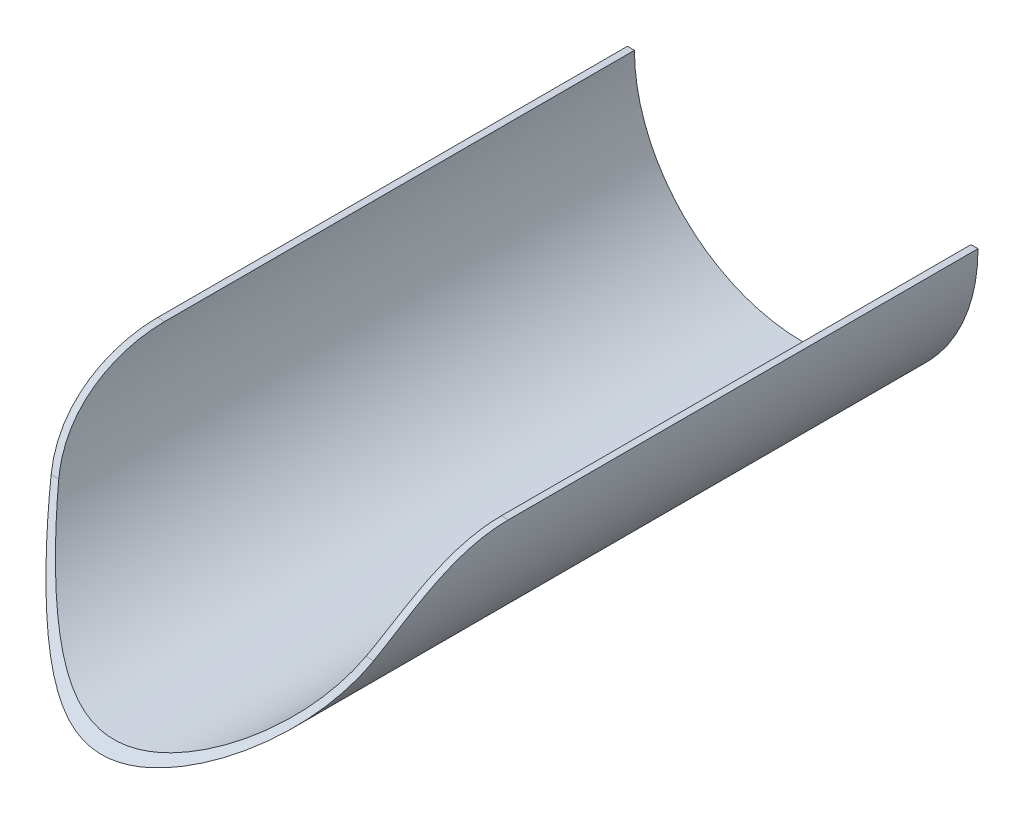
ISO-10303-21;
HEADER;
FILE_DESCRIPTION(('STEP AP214'),'2;1');
FILE_NAME('part.step','',(''),(''),'','','');
FILE_SCHEMA(('AUTOMOTIVE_DESIGN { 1 0 10303 214 1 1 1 1 }'));
ENDSEC;
DATA;
#1=APPLICATION_CONTEXT('core data for automotive mechanical design processes');
#2=APPLICATION_PROTOCOL_DEFINITION('international standard','automotive_design',2000,#1);
#3=PRODUCT_CONTEXT('',#1,'mechanical');
#4=PRODUCT('Part','Part','',(#3));
#5=PRODUCT_RELATED_PRODUCT_CATEGORY('part','',(#4));
#6=PRODUCT_DEFINITION_FORMATION('','',#4);
#7=PRODUCT_DEFINITION_CONTEXT('part definition',#1,'design');
#8=PRODUCT_DEFINITION('design','',#6,#7);
#9=PRODUCT_DEFINITION_SHAPE('','',#8);
#10=(LENGTH_UNIT() NAMED_UNIT(*) SI_UNIT(.MILLI.,.METRE.));
#11=(NAMED_UNIT(*) PLANE_ANGLE_UNIT() SI_UNIT($,.RADIAN.));
#12=(NAMED_UNIT(*) SI_UNIT($,.STERADIAN.) SOLID_ANGLE_UNIT());
#13=UNCERTAINTY_MEASURE_WITH_UNIT(LENGTH_MEASURE(1.E-05),#10,'distance_accuracy_value','');
#14=(GEOMETRIC_REPRESENTATION_CONTEXT(3) GLOBAL_UNCERTAINTY_ASSIGNED_CONTEXT((#13)) GLOBAL_UNIT_ASSIGNED_CONTEXT((#10,
#11,#12)) REPRESENTATION_CONTEXT('',''));
#15=CARTESIAN_POINT('',(0.,0.,0.));
#16=DIRECTION('',(0.,0.,1.));
#17=DIRECTION('',(1.,0.,0.));
#18=AXIS2_PLACEMENT_3D('',#15,#16,#17);
#19=CARTESIAN_POINT('',(0.,0.,-200.));
#20=DIRECTION('',(0.,0.,1.));
#21=DIRECTION('',(1.,0.,0.));
#22=AXIS2_PLACEMENT_3D('',#19,#20,#21);
#23=CYLINDRICAL_SURFACE('',#22,50.);
#24=DIRECTION('',(0.,0.,1.));
#25=VECTOR('',#24,1.);
#26=CARTESIAN_POINT('',(50.,0.,-200.));
#27=LINE('',#26,#25);
#28=CARTESIAN_POINT('',(50.,0.,-200.));
#29=VERTEX_POINT('',#28);
#30=CARTESIAN_POINT('',(50.,0.,-66.028109136122));
#31=VERTEX_POINT('',#30);
#32=EDGE_CURVE('E105',#29,#31,#27,.T.);
#33=ORIENTED_EDGE('',*,*,#32,.T.);
#34=CARTESIAN_POINT('',(50.,0.,-66.0281091361219));
#35=CARTESIAN_POINT('',(49.9999823365461,7.37992042129467E-06,-65.4691817525423));
#36=CARTESIAN_POINT('',(49.9999993858969,-0.0117147199404949,-64.9102549220402));
#37=CARTESIAN_POINT('',(49.999975918324,-0.058564281366747,-63.7933970079425));
#38=CARTESIAN_POINT('',(49.9999354028434,-0.0936911561537507,-63.2354658997347));
#39=CARTESIAN_POINT('',(49.9996698278945,-0.187295856108741,-62.1215756873062));
#40=CARTESIAN_POINT('',(49.9994447716533,-0.245773272935,-61.5656165487723));
#41=CARTESIAN_POINT('',(49.9985596761442,-0.385975458941323,-60.4566249126709));
#42=CARTESIAN_POINT('',(49.9978996269442,-0.467700758916742,-59.9035924822198));
#43=CARTESIAN_POINT('',(49.9958057025399,-0.654303908152532,-58.8011520009052));
#44=CARTESIAN_POINT('',(49.9943714247691,-0.759193785243319,-58.2517459861894));
#45=CARTESIAN_POINT('',(49.9902956401348,-0.991906418387271,-57.1578605990558));
#46=CARTESIAN_POINT('',(49.9876542201822,-1.11972752305347,-56.6133808748363));
#47=CARTESIAN_POINT('',(49.9806442436695,-1.39806964983598,-55.5303226121921));
#48=CARTESIAN_POINT('',(49.9762758862357,-1.54858805358068,-54.9917434007585));
#49=CARTESIAN_POINT('',(49.9652017434662,-1.87209157998755,-53.9212751727426));
#50=CARTESIAN_POINT('',(49.9584953191497,-2.0450828362406,-53.3893880262787));
#51=CARTESIAN_POINT('',(49.9338520839336,-2.59750480108549,-51.8047162148706));
#52=CARTESIAN_POINT('',(49.911393259374,-3.01025931786121,-50.7634049833434));
#53=CARTESIAN_POINT('',(49.8480772858908,-3.92140980930672,-48.7195263274592));
#54=CARTESIAN_POINT('',(49.8072208717237,-4.41980236330324,-47.7169573575635));
#55=CARTESIAN_POINT('',(49.7266148423895,-5.22847732353928,-46.247964089247));
#56=CARTESIAN_POINT('',(49.6965174889052,-5.50828255745755,-45.7640106580392));
#57=CARTESIAN_POINT('',(49.6288817516146,-6.08762472485334,-44.8087157222229));
#58=CARTESIAN_POINT('',(49.5913452424956,-6.38715667447343,-44.3373710740625));
#59=CARTESIAN_POINT('',(49.507804225239,-7.00532535392411,-43.4081425133676));
#60=CARTESIAN_POINT('',(49.4617995133157,-7.32396254339406,-42.9502589250783));
#61=CARTESIAN_POINT('',(49.360268664288,-7.97959394205546,-42.0488642756767));
#62=CARTESIAN_POINT('',(49.3047419652668,-8.31658923380448,-41.6053540646119));
#63=CARTESIAN_POINT('',(49.1846308744111,-8.99940092558499,-40.7445758347298));
#64=CARTESIAN_POINT('',(49.120307912005,-9.34478556200402,-40.3269288580288));
#65=CARTESIAN_POINT('',(48.9806181850818,-10.0513042216273,-39.5070138367654));
#66=CARTESIAN_POINT('',(48.9052504313112,-10.4124396535527,-39.104747173852));
#67=CARTESIAN_POINT('',(48.742500749077,-11.1494871951787,-38.3163943951228));
#68=CARTESIAN_POINT('',(48.6551171104435,-11.5254014028317,-37.9303105927692));
#69=CARTESIAN_POINT('',(48.4674140506273,-12.2908523090685,-37.1751688516538));
#70=CARTESIAN_POINT('',(48.3670947982314,-12.680388829857,-36.8061106908226));
#71=CARTESIAN_POINT('',(48.1529206285036,-13.470837206988,-36.0866936784044));
#72=CARTESIAN_POINT('',(48.0391020541867,-13.8717164037775,-35.7362881404191));
#73=CARTESIAN_POINT('',(47.7969239637269,-14.6844758686762,-35.0538330919658));
#74=CARTESIAN_POINT('',(47.668566195232,-15.0963548100491,-34.7217813824456));
#75=CARTESIAN_POINT('',(47.3966635562282,-15.9294746354722,-34.0767842409296));
#76=CARTESIAN_POINT('',(47.2531288228928,-16.3507091239547,-33.7638262732077));
#77=CARTESIAN_POINT('',(46.9501898997603,-17.2012616327289,-33.1572971619909));
#78=CARTESIAN_POINT('',(46.7907883912024,-17.6305782773525,-32.8637227568732));
#79=CARTESIAN_POINT('',(46.5234427521607,-18.3206316464158,-32.411151615802));
#80=CARTESIAN_POINT('',(46.4207866612099,-18.5792650738851,-32.2457811371683));
#81=CARTESIAN_POINT('',(46.2096718814042,-19.0982899235291,-31.9222154091747));
#82=CARTESIAN_POINT('',(46.1012183739589,-19.3586796000005,-31.7640139787083));
#83=CARTESIAN_POINT('',(45.989776227236,-19.6199001671454,-31.6093420053416));
#84=B_SPLINE_CURVE_WITH_KNOTS('',3,(#34,#35,#36,#37,#38,#39,#40,#41,#42,#43,#44,#45,#46,#47,#48,
#49,#50,#51,#52,#53,#54,#55,#56,#57,#58,#59,#60,#61,#62,#63,#64,#65,#66,#67,#68,#69,#70,#71,#72,
#73,#74,#75,#76,#77,#78,#79,#80,#81,#82,#83),.UNSPECIFIED.,.F.,.F.,(4,2,2,2,2,2,2,2,2,2,2,2,2,2,
2,2,2,2,2,2,2,2,2,2,4),(0.,1.67665844555418,3.35327485738521,5.02986195073361,6.70648732696882,
8.38398531908419,10.0613625550334,11.7385464357422,13.4161890414057,16.7729680450403,
20.1296129987069,21.8086485438499,23.4872615042891,25.1659148655001,26.8446673224768,
28.4814108378919,30.1183010419149,31.7554244591673,33.3925265170113,35.0253171391137,
36.6579117034918,38.2894226135922,39.9206582901536,40.8916124346742,41.8617128492752),.UNSPECIFIED.);
#85=CARTESIAN_POINT('',(45.9897762272361,-19.6199001671454,-31.6093420053416));
#86=VERTEX_POINT('',#85);
#87=EDGE_CURVE('E142',#31,#86,#84,.T.);
#88=ORIENTED_EDGE('',*,*,#87,.T.);
#89=CARTESIAN_POINT('',(-50.,0.,-40.));
#90=CARTESIAN_POINT('',(-50.0000166515254,-0.70213859406181,-39.8029483411825));
#91=CARTESIAN_POINT('',(-49.9852107268647,-1.40159674025909,-39.5964983749295));
#92=CARTESIAN_POINT('',(-49.926753027816,-2.79357891929848,-39.1654226417842));
#93=CARTESIAN_POINT('',(-49.8831050128129,-3.48610384390162,-38.9407992470322));
#94=CARTESIAN_POINT('',(-49.7678274407851,-4.86204933818628,-38.474210575254));
#95=CARTESIAN_POINT('',(-49.6962296789266,-5.54547934378737,-38.2322652578437));
#96=CARTESIAN_POINT('',(-49.5259609542399,-6.90268863252776,-37.7315319779802));
#97=CARTESIAN_POINT('',(-49.4272891944134,-7.57646763094839,-37.4727435198735));
#98=CARTESIAN_POINT('',(-49.0938657517247,-9.57069769569858,-36.6765460334972));
#99=CARTESIAN_POINT('',(-48.820713358768,-10.8755231810728,-36.1153985601156));
#100=CARTESIAN_POINT('',(-48.179265895774,-13.4350511781154,-34.9361142832164));
#101=CARTESIAN_POINT('',(-47.8109449507695,-14.6897399510399,-34.3179620103501));
#102=CARTESIAN_POINT('',(-46.9889554966474,-17.13758971285,-33.034580796262));
#103=CARTESIAN_POINT('',(-46.5356985242181,-18.3310134347792,-32.3695881206077));
#104=CARTESIAN_POINT('',(-45.5500974547824,-20.6588080431705,-30.9968150768149));
#105=CARTESIAN_POINT('',(-45.0177587145596,-21.7931829224178,-30.289037608726));
#106=CARTESIAN_POINT('',(-43.8793966944171,-24.0030589302271,-28.8357418110219));
#107=CARTESIAN_POINT('',(-43.2732163287611,-25.0784272318827,-28.0901450637696));
#108=CARTESIAN_POINT('',(-41.9939045362479,-27.1663629335177,-26.5691659027884));
#109=CARTESIAN_POINT('',(-41.3207686860257,-28.1789261771429,-25.7937815232413));
#110=CARTESIAN_POINT('',(-39.7858502447651,-30.316915620651,-24.0782181759963));
#111=CARTESIAN_POINT('',(-38.9119008960172,-31.4299439078302,-23.1334560595002));
#112=CARTESIAN_POINT('',(-37.0835752987146,-33.5676529565,-21.2219826179272));
#113=CARTESIAN_POINT('',(-36.1291862950728,-34.5923196544326,-20.2552678296996));
#114=CARTESIAN_POINT('',(-34.1431264627222,-36.5540229133261,-18.3103922395883));
#115=CARTESIAN_POINT('',(-33.1114092489635,-37.4910061076603,-17.3322248695596));
#116=CARTESIAN_POINT('',(-31.507514772844,-38.829899170851,-15.866518752148));
#117=CARTESIAN_POINT('',(-30.9635005028348,-39.265097329751,-15.3782106584818));
#118=CARTESIAN_POINT('',(-29.8564962599313,-40.1132875982573,-14.4038591798532));
#119=CARTESIAN_POINT('',(-29.2935067158244,-40.5262802090995,-13.917815743998));
#120=CARTESIAN_POINT('',(-27.7629814618052,-41.6003250927633,-12.6242685254055));
#121=CARTESIAN_POINT('',(-26.7780621925471,-42.2413682723158,-11.8204536695296));
#122=CARTESIAN_POINT('',(-25.2584885750861,-43.1550439664906,-10.63197777045));
#123=CARTESIAN_POINT('',(-24.7448412861316,-43.4516670595139,-10.2386285723616));
#124=CARTESIAN_POINT('',(-23.7029744536882,-44.0286687310526,-9.45941216737689));
#125=CARTESIAN_POINT('',(-23.174756070672,-44.3090485977307,-9.07354436879036));
#126=CARTESIAN_POINT('',(-22.1039284002549,-44.8528307752042,-8.31176712045077));
#127=CARTESIAN_POINT('',(-21.561340355166,-45.1162563659735,-7.93584445190159));
#128=CARTESIAN_POINT('',(-20.4604584175561,-45.6260624709951,-7.19570555061834));
#129=CARTESIAN_POINT('',(-19.9021660530581,-45.8724446355504,-6.83148818630142));
#130=CARTESIAN_POINT('',(-18.7694308618506,-46.3474425481284,-6.11758992915975));
#131=CARTESIAN_POINT('',(-18.1949973401925,-46.5760682574212,-5.76790093796448));
#132=CARTESIAN_POINT('',(-17.0288636918486,-47.0149548912113,-5.08592719815953));
#133=CARTESIAN_POINT('',(-16.4371607211525,-47.2252127677841,-4.75364534170626));
#134=CARTESIAN_POINT('',(-15.1310165015744,-47.6613638234835,-4.05403697486714));
#135=CARTESIAN_POINT('',(-14.4131781367523,-47.8835807453031,-3.69071633883252));
#136=CARTESIAN_POINT('',(-12.9523233735428,-48.2992104765723,-3.00036302412713));
#137=CARTESIAN_POINT('',(-12.2093154193711,-48.4926328311795,-2.67331832949106));
#138=CARTESIAN_POINT('',(-10.6990268608898,-48.848046515203,-2.0640424903433));
#139=CARTESIAN_POINT('',(-9.93178463211347,-49.0100848989931,-1.78174437398136));
#140=CARTESIAN_POINT('',(-8.37337948270041,-49.3002450106318,-1.27050885851047));
#141=CARTESIAN_POINT('',(-7.58222162063993,-49.4283738557807,-1.0415602630353));
#142=CARTESIAN_POINT('',(-6.1128333896404,-49.6295061147206,-0.679170062350853));
#143=CARTESIAN_POINT('',(-5.43773534799316,-49.7081360649757,-0.536173247439457));
#144=CARTESIAN_POINT('',(-4.07647089353453,-49.8382344346665,-0.298453695164832));
#145=CARTESIAN_POINT('',(-3.39030576600388,-49.8897059850781,-0.203725393173996));
#146=CARTESIAN_POINT('',(-2.01182456477616,-49.9642723452382,-0.0661978810917193));
#147=CARTESIAN_POINT('',(-1.31951453914498,-49.987392485385,-0.0233523171064028));
#148=CARTESIAN_POINT('',(0.0667362609040078,-50.004759939618,0.00881521573370331));
#149=CARTESIAN_POINT('',(0.760677056252655,-49.9990068810726,-0.00186350618499218));
#150=CARTESIAN_POINT('',(2.14420646646611,-49.9587924744942,-0.0762691177622148));
#151=CARTESIAN_POINT('',(2.83379844499473,-49.9243570500153,-0.139948104943799));
#152=CARTESIAN_POINT('',(4.20439825581935,-49.8276543944025,-0.317749796118042));
#153=CARTESIAN_POINT('',(4.88540599208157,-49.7653868521883,-0.431873063927503));
#154=CARTESIAN_POINT('',(6.23580346116689,-49.6142826043149,-0.706596247533746));
#155=CARTESIAN_POINT('',(6.90517729514924,-49.5254121660796,-0.867255162290565));
#156=CARTESIAN_POINT('',(8.22872588592447,-49.322779393387,-1.2299036260258));
#157=CARTESIAN_POINT('',(8.88289857995888,-49.2090137022718,-1.43189874817816));
#158=CARTESIAN_POINT('',(10.5432511987192,-48.88668267134,-1.9974874516959));
#159=CARTESIAN_POINT('',(11.5371709600772,-48.6610762715996,-2.3875004515786));
#160=CARTESIAN_POINT('',(13.4816436443705,-48.1586475326466,-3.2365169000886));
#161=CARTESIAN_POINT('',(14.4321695004924,-47.881793757791,-3.69556266149235));
#162=CARTESIAN_POINT('',(16.2934773649924,-47.2808808174802,-4.6672423060366));
#163=CARTESIAN_POINT('',(17.2041332919659,-46.9566842377902,-5.18003091303463));
#164=CARTESIAN_POINT('',(18.9850792127829,-46.2653136934132,-6.24461338090646));
#165=CARTESIAN_POINT('',(19.8553723402157,-45.8981430728655,-6.7964042053972));
#166=CARTESIAN_POINT('',(21.4484778382986,-45.1732936586556,-7.85555468874235));
#167=CARTESIAN_POINT('',(22.1758339881033,-44.82049905692,-8.35946528124142));
#168=CARTESIAN_POINT('',(23.6036992346997,-44.0852619372163,-9.38362043560669));
#169=CARTESIAN_POINT('',(24.3042044892813,-43.7028151996889,-9.90386731586949));
#170=CARTESIAN_POINT('',(25.6799216337246,-42.9088880272792,-10.9564323306735));
#171=CARTESIAN_POINT('',(26.3551189215496,-42.4973912143327,-11.4887571579819));
#172=CARTESIAN_POINT('',(27.680739515376,-41.646093399702,-12.5614514889695));
#173=CARTESIAN_POINT('',(28.3311638970414,-41.2062936291956,-13.1018206419359));
#174=CARTESIAN_POINT('',(29.6089847906771,-40.2979343082763,-14.1883857109376));
#175=CARTESIAN_POINT('',(30.2363408109814,-39.829327716175,-14.7345898858781));
#176=CARTESIAN_POINT('',(31.4672166557683,-38.8641980400764,-15.8291915926487));
#177=CARTESIAN_POINT('',(32.0707362987125,-38.3676747435347,-16.3775891411485));
#178=CARTESIAN_POINT('',(33.2538484185562,-37.3469119065694,-17.4740129308747));
#179=CARTESIAN_POINT('',(33.833446458309,-36.822678875321,-18.022039228944));
#180=CARTESIAN_POINT('',(34.9686484774629,-35.7464036078525,-19.1156399481603));
#181=CARTESIAN_POINT('',(35.524252370468,-35.1943612715147,-19.6612143604724));
#182=CARTESIAN_POINT('',(36.6343303471235,-34.038146080434,-20.7711844883897));
#183=CARTESIAN_POINT('',(37.1877319805618,-33.4327526703666,-21.3353827298163));
#184=CARTESIAN_POINT('',(38.2671266022374,-32.1916659270584,-22.4566625075091));
#185=CARTESIAN_POINT('',(38.7931193495359,-31.5559723275568,-23.0137439811827));
#186=CARTESIAN_POINT('',(39.8166659769652,-30.2542343624833,-24.1186889631493));
#187=CARTESIAN_POINT('',(40.3142172910322,-29.5881872680489,-24.6665516365603));
#188=CARTESIAN_POINT('',(41.2795609625968,-28.225784661786,-25.750953576122));
#189=CARTESIAN_POINT('',(41.7473496757245,-27.5294254558158,-26.2874914502196));
#190=CARTESIAN_POINT('',(42.6492021146598,-26.1103178778143,-27.3443246177579));
#191=CARTESIAN_POINT('',(43.0834270397772,-25.3877237892635,-27.864689301449));
#192=CARTESIAN_POINT('',(43.9190165296726,-23.9131363751196,-28.8899179796105));
#193=CARTESIAN_POINT('',(44.3203820416326,-23.1611438978673,-29.3947824206174));
#194=CARTESIAN_POINT('',(45.0882246809871,-21.6283754558449,-30.386807693329));
#195=CARTESIAN_POINT('',(45.454706827679,-20.8476036545701,-30.8739710657491));
#196=CARTESIAN_POINT('',(46.1506616568155,-19.2579628522521,-31.8284739420908));
#197=CARTESIAN_POINT('',(46.4801366945637,-18.4490956436256,-32.2958147064354));
#198=CARTESIAN_POINT('',(47.0420302420258,-16.957557412838,-33.1234500131079));
#199=CARTESIAN_POINT('',(47.2810954303527,-16.2794474662633,-33.4874679006216));
#200=CARTESIAN_POINT('',(47.7318651087405,-14.9060833068806,-34.1997264663915));
#201=CARTESIAN_POINT('',(47.9435711224232,-14.2108300513468,-34.5479680225233));
#202=CARTESIAN_POINT('',(48.3382035610545,-12.8043483469487,-35.2273661517905));
#203=CARTESIAN_POINT('',(48.5211414724719,-12.0931264043175,-35.5585295081971));
#204=CARTESIAN_POINT('',(48.8569543666851,-10.6556417108114,-36.2027125714298));
#205=CARTESIAN_POINT('',(49.0098337741674,-9.92938119107562,-36.5157349438625));
#206=CARTESIAN_POINT('',(49.2858304149301,-8.45437462698053,-37.1261421921178));
#207=CARTESIAN_POINT('',(49.408575719533,-7.70546446656435,-37.4232993409947));
#208=CARTESIAN_POINT('',(49.6205864577039,-6.19507647526631,-37.9968355323394));
#209=CARTESIAN_POINT('',(49.7098533823524,-5.43359920568343,-38.2732154997553));
#210=CARTESIAN_POINT('',(49.8537555202546,-3.89848433794986,-38.8046607671039));
#211=CARTESIAN_POINT('',(49.9083300770188,-3.12482785170756,-39.0596880617491));
#212=CARTESIAN_POINT('',(49.9814692343807,-1.56857111378079,-39.547076439521));
#213=CARTESIAN_POINT('',(50.0000270252091,-0.785969198895061,-39.7794332283995));
#214=CARTESIAN_POINT('',(50.,0.,-40.));
#215=B_SPLINE_CURVE_WITH_KNOTS('',3,(#89,#90,#91,#92,#93,#94,#95,#96,#97,#98,#99,#100,#101,#102,
#103,#104,#105,#106,#107,#108,#109,#110,#111,#112,#113,#114,#115,#116,#117,#118,#119,#120,#121,
#122,#123,#124,#125,#126,#127,#128,#129,#130,#131,#132,#133,#134,#135,#136,#137,#138,#139,#140,
#141,#142,#143,#144,#145,#146,#147,#148,#149,#150,#151,#152,#153,#154,#155,#156,#157,#158,#159,
#160,#161,#162,#163,#164,#165,#166,#167,#168,#169,#170,#171,#172,#173,#174,#175,#176,#177,#178,
#179,#180,#181,#182,#183,#184,#185,#186,#187,#188,#189,#190,#191,#192,#193,#194,#195,#196,#197,
#198,#199,#200,#201,#202,#203,#204,#205,#206,#207,#208,#209,#210,#211,#212,#213,#214),
.UNSPECIFIED.,.F.,.F.,(4,2,2,2,2,2,2,2,2,2,2,2,2,2,2,2,2,2,2,2,2,2,2,2,2,2,2,2,2,2,2,2,2,2,2,2,
2,2,2,2,2,2,2,2,2,2,2,2,2,2,2,2,2,2,2,2,2,2,2,2,2,2,4),(0.,2.1875168602486,4.37474864767646,
6.55949949362215,8.74431466067948,13.0775730213155,17.4120107748684,21.7259660433559,
26.0396292293895,30.3626347535307,34.6859260637913,39.7857959121698,44.8864759592927,
49.990240502492,52.5420900865031,55.0938820445596,59.3621750712863,61.4970426792057,
63.6317407498731,65.7634422088098,67.8949369668008,70.0252271991579,72.1558702591548,
74.6583921650178,77.1600826497386,79.6579927799569,82.1553782052529,84.2369144698139,
86.3182107104837,88.397646071422,90.4771082691967,92.5546930545396,94.6323010616792,
96.7125547242202,98.7930890429624,102.061446088057,105.3318146594,108.611871557416,
111.891673378579,114.748436512153,117.605606917713,120.464401226142,123.323071261065,
126.186540356646,129.050031256258,131.912852469234,134.775683989535,137.761415572073,
140.747173396359,143.733200180076,146.719591895805,149.690611695186,152.661545823897,
155.632051822586,158.602368657274,161.01935763908,163.436211961656,165.852098823932,
168.267629794963,170.711624078081,173.155509496169,175.603656160536,178.052265656315),.UNSPECIFIED.);
#216=CARTESIAN_POINT('',(-45.989776227236,-19.6199001671455,-31.6093420053416));
#217=VERTEX_POINT('',#216);
#218=EDGE_CURVE('E116',#217,#86,#215,.T.);
#219=ORIENTED_EDGE('',*,*,#218,.F.);
#220=CARTESIAN_POINT('',(-45.989776227236,-19.6199001671454,-31.6093420053416));
#221=CARTESIAN_POINT('',(-46.1638864939545,-19.2118105365517,-31.8509595585323));
#222=CARTESIAN_POINT('',(-46.3306911932307,-18.8057340855283,-32.1012288183695));
#223=CARTESIAN_POINT('',(-46.6500527366944,-17.9989022839164,-32.6188137318974));
#224=CARTESIAN_POINT('',(-46.8026101775529,-17.5981467110947,-32.8861286709304));
#225=CARTESIAN_POINT('',(-47.0937744661689,-16.8034368394577,-33.4374157072449));
#226=CARTESIAN_POINT('',(-47.2323889835127,-16.4094789013722,-33.7213785094496));
#227=CARTESIAN_POINT('',(-47.4962414124045,-15.6293504049217,-34.3057361794275));
#228=CARTESIAN_POINT('',(-47.6214792587271,-15.243179884536,-34.6061311273136));
#229=CARTESIAN_POINT('',(-47.8584885484955,-14.4818222546159,-35.22127872464));
#230=CARTESIAN_POINT('',(-47.9703286086906,-14.106587348847,-35.5359457360223));
#231=CARTESIAN_POINT('',(-48.1819274488224,-13.3660109095061,-36.1806332739209));
#232=CARTESIAN_POINT('',(-48.2816849755276,-13.000670405253,-36.5106553882026));
#233=CARTESIAN_POINT('',(-48.5637933940873,-11.9210333186082,-37.5229496227836));
#234=CARTESIAN_POINT('',(-48.7290277261384,-11.2229657591137,-38.2275749343864));
#235=CARTESIAN_POINT('',(-49.0192290843347,-9.87865243067505,-39.6901115836841));
#236=CARTESIAN_POINT('',(-49.1442555150282,-9.23233128081551,-40.4479422767863));
#237=CARTESIAN_POINT('',(-49.3604897155151,-7.99599327707887,-42.0127443198062));
#238=CARTESIAN_POINT('',(-49.4516972956026,-7.40597673905476,-42.8197159453492));
#239=CARTESIAN_POINT('',(-49.6064798277029,-6.28626726804493,-44.4784695592511));
#240=CARTESIAN_POINT('',(-49.6700187056573,-5.75665374732744,-45.3303084334701));
#241=CARTESIAN_POINT('',(-49.7751857184294,-4.76243923133384,-47.072365741264));
#242=CARTESIAN_POINT('',(-49.8168137196957,-4.29783863233809,-47.9625844087361));
#243=CARTESIAN_POINT('',(-49.8854298643487,-3.41339912732233,-49.8250214072773));
#244=CARTESIAN_POINT('',(-49.9115040502353,-2.99734214253325,-50.799070341465));
#245=CARTESIAN_POINT('',(-49.9510602950989,-2.24367325519947,-52.7774319689945));
#246=CARTESIAN_POINT('',(-49.9645406600746,-1.9060719103504,-53.7817487149259));
#247=CARTESIAN_POINT('',(-49.9836699077011,-1.31187842528619,-55.8130170204044));
#248=CARTESIAN_POINT('',(-49.9893264892613,-1.05520683936608,-56.8399453166226));
#249=CARTESIAN_POINT('',(-49.99657175877,-0.624123807745888,-58.9106680113137));
#250=CARTESIAN_POINT('',(-49.9981620383581,-0.449680198029833,-59.9544556496284));
#251=CARTESIAN_POINT('',(-49.9993274251327,-0.264072867048992,-61.4201880790731));
#252=CARTESIAN_POINT('',(-49.999539385552,-0.217853954009562,-61.8379348448955));
#253=CARTESIAN_POINT('',(-49.9998252817484,-0.138609323181862,-62.6746067158028));
#254=CARTESIAN_POINT('',(-49.9998992457392,-0.105580909654192,-63.0935315624814));
#255=CARTESIAN_POINT('',(-50.0000133953639,-0.0264048138218281,-64.3501088715613));
#256=CARTESIAN_POINT('',(-49.9999464834777,2.14400494671849E-05,-65.1890483194644));
#257=CARTESIAN_POINT('',(-50.,0.,-66.0281091361219));
#258=B_SPLINE_CURVE_WITH_KNOTS('',3,(#220,#221,#222,#223,#224,#225,#226,#227,#228,#229,#230,
#231,#232,#233,#234,#235,#236,#237,#238,#239,#240,#241,#242,#243,#244,#245,#246,#247,#248,#249,
#250,#251,#252,#253,#254,#255,#256,#257),.UNSPECIFIED.,.F.,.F.,(4,2,2,2,2,2,2,2,2,2,2,2,2,2,2,2,
2,2,4),(0.,1.51547134992429,3.03087920387107,4.5454488655483,6.06002591199381,7.56648047004503,
9.07309114788159,12.0856989113453,15.0938350746233,18.1019881117046,21.1140514780177,
24.1261332032903,27.3011849031955,30.4766636194839,33.6490153118108,36.8201250859862,
38.0808561475553,39.34132942179,41.857796405752),.UNSPECIFIED.);
#259=CARTESIAN_POINT('',(-50.,0.,-66.028109136122));
#260=VERTEX_POINT('',#259);
#261=EDGE_CURVE('E136',#217,#260,#258,.T.);
#262=ORIENTED_EDGE('',*,*,#261,.T.);
#263=DIRECTION('',(0.,0.,1.));
#264=VECTOR('',#263,1.);
#265=CARTESIAN_POINT('',(-50.,0.,-200.));
#266=LINE('',#265,#264);
#267=CARTESIAN_POINT('',(-50.,0.,-200.));
#268=VERTEX_POINT('',#267);
#269=EDGE_CURVE('E114',#268,#260,#266,.T.);
#270=ORIENTED_EDGE('',*,*,#269,.F.);
#271=CARTESIAN_POINT('',(0.,0.,-200.));
#272=DIRECTION('',(0.,0.,1.));
#273=DIRECTION('',(1.,0.,0.));
#274=AXIS2_PLACEMENT_3D('',#271,#272,#273);
#275=CIRCLE('',#274,50.);
#276=EDGE_CURVE('E96',#268,#29,#275,.T.);
#277=ORIENTED_EDGE('',*,*,#276,.T.);
#278=EDGE_LOOP('',(#33,#88,#219,#262,#270,#277));
#279=FACE_BOUND('',#278,.T.);
#280=ADVANCED_FACE('F36',(#279),#23,.T.);
#281=CARTESIAN_POINT('',(-50.,0.,-200.));
#282=DIRECTION('',(0.,-1.,0.));
#283=DIRECTION('',(1.,0.,0.));
#284=AXIS2_PLACEMENT_3D('',#281,#282,#283);
#285=PLANE('',#284);
#286=ORIENTED_EDGE('',*,*,#269,.T.);
#287=DIRECTION('',(1.,0.,0.));
#288=VECTOR('',#287,1.);
#289=CARTESIAN_POINT('',(-50.,0.,-66.028109136122));
#290=LINE('',#289,#288);
#291=CARTESIAN_POINT('',(-48.,0.,-66.028109136122));
#292=VERTEX_POINT('',#291);
#293=EDGE_CURVE('E11',#260,#292,#290,.T.);
#294=ORIENTED_EDGE('',*,*,#293,.T.);
#295=DIRECTION('',(0.,0.,1.));
#296=VECTOR('',#295,1.);
#297=CARTESIAN_POINT('',(-48.,0.,-200.));
#298=LINE('',#297,#296);
#299=CARTESIAN_POINT('',(-48.,0.,-200.));
#300=VERTEX_POINT('',#299);
#301=EDGE_CURVE('E131',#300,#292,#298,.T.);
#302=ORIENTED_EDGE('',*,*,#301,.F.);
#303=DIRECTION('',(1.,0.,0.));
#304=VECTOR('',#303,1.);
#305=CARTESIAN_POINT('',(-50.,0.,-200.));
#306=LINE('',#305,#304);
#307=EDGE_CURVE('E111',#268,#300,#306,.T.);
#308=ORIENTED_EDGE('',*,*,#307,.F.);
#309=EDGE_LOOP('',(#286,#294,#302,#308));
#310=FACE_BOUND('',#309,.T.);
#311=ADVANCED_FACE('F151',(#310),#285,.F.);
#312=CARTESIAN_POINT('',(0.,0.,-200.));
#313=DIRECTION('',(0.,0.,1.));
#314=DIRECTION('',(1.,0.,0.));
#315=AXIS2_PLACEMENT_3D('',#312,#313,#314);
#316=CYLINDRICAL_SURFACE('',#315,48.);
#317=CARTESIAN_POINT('',(-48.,0.,-40.));
#318=CARTESIAN_POINT('',(-48.0000155205065,-0.678952560198982,-39.809454843484));
#319=CARTESIAN_POINT('',(-47.9855951225324,-1.35539821519408,-39.6101215778464));
#320=CARTESIAN_POINT('',(-47.9286342714386,-2.70176826832647,-39.1944708672173));
#321=CARTESIAN_POINT('',(-47.8860973799618,-3.37169348153209,-38.9781555764734));
#322=CARTESIAN_POINT('',(-47.7737167124723,-4.70295624323894,-38.5293309760646));
#323=CARTESIAN_POINT('',(-47.7039029869841,-5.36430241756024,-38.2968397181287));
#324=CARTESIAN_POINT('',(-47.5378226826352,-6.67786065569283,-37.8161433651041));
#325=CARTESIAN_POINT('',(-47.4415553460938,-7.33007245731622,-37.5679378200855));
#326=CARTESIAN_POINT('',(-47.1161166289136,-9.26096660230114,-36.8048800612506));
#327=CARTESIAN_POINT('',(-46.8493583182905,-10.5248294471573,-36.267892517499));
#328=CARTESIAN_POINT('',(-46.2224128742571,-13.0048413542349,-35.1409490068777));
#329=CARTESIAN_POINT('',(-45.862201111431,-14.2209777408525,-34.5509791034846));
#330=CARTESIAN_POINT('',(-45.0575432313732,-16.5946047219904,-33.3274838581344));
#331=CARTESIAN_POINT('',(-44.6134898404116,-17.7523380658817,-32.6941700270824));
#332=CARTESIAN_POINT('',(-43.6469898780014,-20.0112385635387,-31.3882533685106));
#333=CARTESIAN_POINT('',(-43.1245484539058,-21.1124094251132,-30.7156531225044));
#334=CARTESIAN_POINT('',(-42.0061747089065,-23.2583014283313,-29.3360931032038));
#335=CARTESIAN_POINT('',(-41.4100789129127,-24.3028893225588,-28.6290590889364));
#336=CARTESIAN_POINT('',(-40.1506927147681,-26.331491601189,-27.1885340495989));
#337=CARTESIAN_POINT('',(-39.4873979056735,-27.3155020060786,-26.4550412913855));
#338=CARTESIAN_POINT('',(-37.9775017526388,-29.387507170367,-24.8390983414416));
#339=CARTESIAN_POINT('',(-37.1190588330009,-30.4639454106428,-23.9528735411906));
#340=CARTESIAN_POINT('',(-35.3209080582949,-32.5316988594487,-22.1635863334284));
#341=CARTESIAN_POINT('',(-34.3811865533213,-33.522999714099,-21.2605211177951));
#342=CARTESIAN_POINT('',(-32.4231866404739,-35.4202793096183,-19.4487415545527));
#343=CARTESIAN_POINT('',(-31.4048834768382,-36.3262309614706,-18.5400255103259));
#344=CARTESIAN_POINT('',(-29.8195557746652,-37.6199262309621,-17.1831656365404));
#345=CARTESIAN_POINT('',(-29.2814751947161,-38.0402808375666,-16.7319206226681));
#346=CARTESIAN_POINT('',(-28.1857572467977,-38.8591157498789,-15.8333647459664));
#347=CARTESIAN_POINT('',(-27.6281205226939,-39.2575967746452,-15.386053754219));
#348=CARTESIAN_POINT('',(-26.1593365758559,-40.2601557359468,-14.2362645943682));
#349=CARTESIAN_POINT('',(-25.2330366500288,-40.8474288835274,-13.5383242820781));
#350=CARTESIAN_POINT('',(-23.3282688755315,-41.9644036391685,-12.1677138406276));
#351=CARTESIAN_POINT('',(-22.3497958140547,-42.4940994783455,-11.4950462480446));
#352=CARTESIAN_POINT('',(-20.3388941113704,-43.4923864074226,-10.1887303433295));
#353=CARTESIAN_POINT('',(-19.3065415198486,-43.9610605263088,-9.5550296443376));
#354=CARTESIAN_POINT('',(-17.7147257027843,-44.615211116046,-8.6460790619478));
#355=CARTESIAN_POINT('',(-17.1770020272372,-44.825086022779,-8.350076222046));
#356=CARTESIAN_POINT('',(-16.0864785340949,-45.2279031613162,-7.77439175485409));
#357=CARTESIAN_POINT('',(-15.5336756609868,-45.4208419274198,-7.49471347201907));
#358=CARTESIAN_POINT('',(-14.2476019554132,-45.8430925077127,-6.87502172298607));
#359=CARTESIAN_POINT('',(-13.5091649187373,-46.0663629298239,-6.54152263204098));
#360=CARTESIAN_POINT('',(-12.0069760203136,-46.4805254658113,-5.91416253084682));
#361=CARTESIAN_POINT('',(-11.2432326172221,-46.6714282706285,-5.62028843915378));
#362=CARTESIAN_POINT('',(-9.69231048447928,-47.0179683386243,-5.08049318003891));
#363=CARTESIAN_POINT('',(-8.90516785706988,-47.1736570322472,-4.83450215329607));
#364=CARTESIAN_POINT('',(-7.30895220330858,-47.4471774106843,-4.39835081819607));
#365=CARTESIAN_POINT('',(-6.49987955953947,-47.5650097554658,-4.20818953653812));
#366=CARTESIAN_POINT('',(-4.85308391036266,-47.7613262682093,-3.88941744752032));
#367=CARTESIAN_POINT('',(-4.01511984320889,-47.8392465574051,-3.76168979537847));
#368=CARTESIAN_POINT('',(-2.32836988906496,-47.9509415521005,-3.57809786565602));
#369=CARTESIAN_POINT('',(-1.47958475664336,-47.984719318904,-3.52222860466759));
#370=CARTESIAN_POINT('',(0.219904445130594,-48.0070157712221,-3.48538362260955));
#371=CARTESIAN_POINT('',(1.0706076788598,-47.9955513650217,-3.50437992215016));
#372=CARTESIAN_POINT('',(2.76528575693136,-47.9277821964732,-3.6161659015776));
#373=CARTESIAN_POINT('',(3.60926076985431,-47.8714785611946,-3.70895372665598));
#374=CARTESIAN_POINT('',(5.14824096619001,-47.7283336742579,-3.94298163149118));
#375=CARTESIAN_POINT('',(5.84543026991292,-47.6478379344664,-4.07406481914249));
#376=CARTESIAN_POINT('',(7.22606227324005,-47.4580824001978,-4.38044244322249));
#377=CARTESIAN_POINT('',(7.90950334796811,-47.3488192270048,-4.55574207274125));
#378=CARTESIAN_POINT('',(9.26047477916376,-47.1032419017317,-4.9456598434633));
#379=CARTESIAN_POINT('',(9.92799515689644,-46.9669112588487,-5.16030194783874));
#380=CARTESIAN_POINT('',(11.2453166264915,-46.6690373302057,-5.62367882516174));
#381=CARTESIAN_POINT('',(11.895114879215,-46.5074900322087,-5.87241902270885));
#382=CARTESIAN_POINT('',(13.6743036805181,-46.0261309353072,-6.60368691774973));
#383=CARTESIAN_POINT('',(14.7839904764751,-45.6808862683834,-7.11768289040169));
#384=CARTESIAN_POINT('',(16.9458670153937,-44.923838474105,-8.21331104421554));
#385=CARTESIAN_POINT('',(17.9980156718613,-44.5119885951574,-8.79499065290249));
#386=CARTESIAN_POINT('',(20.0505570812612,-43.6260061789351,-10.0085998566184));
#387=CARTESIAN_POINT('',(21.0507685411593,-43.1516735678013,-10.6406881832315));
#388=CARTESIAN_POINT('',(22.9987884459198,-42.1456682975627,-11.9384375324681));
#389=CARTESIAN_POINT('',(23.9466027725861,-41.6140020942516,-12.6040947707296));
#390=CARTESIAN_POINT('',(25.5613631857871,-40.635828316045,-13.7879986297308));
#391=CARTESIAN_POINT('',(26.2392070281519,-40.2013358860174,-14.301416655663));
#392=CARTESIAN_POINT('',(27.5678778705568,-39.3021081571615,-15.336823759079));
#393=CARTESIAN_POINT('',(28.2187024960868,-38.8373702094648,-15.8588135842701));
#394=CARTESIAN_POINT('',(29.494023046373,-37.8779562288976,-16.9081251277611));
#395=CARTESIAN_POINT('',(30.1185075981409,-37.3832674840486,-17.4354490297807));
#396=CARTESIAN_POINT('',(31.3410386846044,-36.364438722465,-18.4922323860196));
#397=CARTESIAN_POINT('',(31.9390859843137,-35.840299558934,-19.0216917779598));
#398=CARTESIAN_POINT('',(33.1084943797609,-34.7629035472213,-20.0799491621924));
#399=CARTESIAN_POINT('',(33.6798633014078,-34.2096553405426,-20.6087473035946));
#400=CARTESIAN_POINT('',(34.7957367395786,-33.0740142905624,-21.6634179855709));
#401=CARTESIAN_POINT('',(35.3402408129718,-32.4916209668367,-22.18929047776));
#402=CARTESIAN_POINT('',(36.401551060666,-31.2979965185145,-23.2356471310132));
#403=CARTESIAN_POINT('',(36.9183671780385,-30.6867758964325,-23.7561331715006));
#404=CARTESIAN_POINT('',(37.9236082315535,-29.4354223068486,-24.7897347464206));
#405=CARTESIAN_POINT('',(38.4120316986464,-28.7952878463705,-25.3028498984475));
#406=CARTESIAN_POINT('',(39.6681635132007,-27.0595286785454,-26.6510198522934));
#407=CARTESIAN_POINT('',(40.4104455429805,-25.9389306569827,-27.4779594711609));
#408=CARTESIAN_POINT('',(41.8079325076298,-23.6205115385931,-29.0964958944726));
#409=CARTESIAN_POINT('',(42.463138653299,-22.4226915158908,-29.8880931902541));
#410=CARTESIAN_POINT('',(43.6763904897111,-19.9563309057613,-31.4239926646522));
#411=CARTESIAN_POINT('',(44.2347562941708,-18.6880423555908,-32.1684452938648));
#412=CARTESIAN_POINT('',(45.2476005096234,-16.0813093974326,-33.6033824611659));
#413=CARTESIAN_POINT('',(45.7021000951513,-14.7428793572552,-34.2938779802198));
#414=CARTESIAN_POINT('',(46.4037560357183,-12.3241294284416,-35.4568364680296));
#415=CARTESIAN_POINT('',(46.6745407833777,-11.2569179592013,-35.9424476273449));
#416=CARTESIAN_POINT('',(47.1445826565224,-9.08938582464986,-36.8724261358107));
#417=CARTESIAN_POINT('',(47.3438627502493,-7.98907591430194,-37.3168066947097));
#418=CARTESIAN_POINT('',(47.5862430418199,-6.31432204994487,-37.9508859037241));
#419=CARTESIAN_POINT('',(47.6577498950603,-5.75018409801036,-38.1574366552763));
#420=CARTESIAN_POINT('',(47.7809812869409,-4.61555708987422,-38.558731739078));
#421=CARTESIAN_POINT('',(47.8327062399484,-4.04506816696271,-38.753476318557));
#422=CARTESIAN_POINT('',(47.9158824807833,-2.8981125505457,-39.1308960101165));
#423=CARTESIAN_POINT('',(47.9473166934139,-2.32164123607541,-39.3135608410619));
#424=CARTESIAN_POINT('',(47.9893805985934,-1.16405994751921,-39.6663087542188));
#425=CARTESIAN_POINT('',(48.0000085998051,-0.582949600181271,-39.8363908124951));
#426=CARTESIAN_POINT('',(48.,0.,-40.));
#427=B_SPLINE_CURVE_WITH_KNOTS('',3,(#317,#318,#319,#320,#321,#322,#323,#324,#325,#326,#327,
#328,#329,#330,#331,#332,#333,#334,#335,#336,#337,#338,#339,#340,#341,#342,#343,#344,#345,#346,
#347,#348,#349,#350,#351,#352,#353,#354,#355,#356,#357,#358,#359,#360,#361,#362,#363,#364,#365,
#366,#367,#368,#369,#370,#371,#372,#373,#374,#375,#376,#377,#378,#379,#380,#381,#382,#383,#384,
#385,#386,#387,#388,#389,#390,#391,#392,#393,#394,#395,#396,#397,#398,#399,#400,#401,#402,#403,
#404,#405,#406,#407,#408,#409,#410,#411,#412,#413,#414,#415,#416,#417,#418,#419,#420,#421,#422,
#423,#424,#425,#426),.UNSPECIFIED.,.F.,.F.,(4,2,2,2,2,2,2,2,2,2,2,2,2,2,2,2,2,2,2,2,2,2,2,2,2,2,
2,2,2,2,2,2,2,2,2,2,2,2,2,2,2,2,2,2,2,2,2,2,2,2,2,2,2,2,4),(0.,2.11528432592615,
4.23030075059708,6.3429936303905,8.45574702796153,12.6466730456127,16.8387046949671,
21.0115666768624,25.1841547674465,29.3661760798738,33.5484718290322,38.4559884891573,
43.3643309226521,48.2742260051636,50.7291087762652,53.1839107986678,57.0814206969891,
60.9793207419878,64.8718604286551,66.8174619588436,68.7634607005009,71.2830500742969,
73.8018056060575,76.3168583770398,78.8318672995641,81.381490879548,83.9309376325932,
86.479431675229,89.0278616614727,91.1675922112539,93.3075741831576,95.4488639579191,
97.5904947825128,101.396354174441,105.20489666692,109.025945087662,112.846563704636,
115.710429605867,118.574546659657,121.43988796651,124.305146304744,127.169558790728,
130.034018508867,132.897442573953,135.761014662358,140.490748887966,145.220417339217,
149.934140479313,154.646901804175,158.254078975975,161.860096435261,163.674717788541,
165.489301129237,167.305409506089,169.121665508296),.UNSPECIFIED.);
#428=CARTESIAN_POINT('',(-43.8070715459416,-19.6199001671454,-31.6093420053416));
#429=VERTEX_POINT('',#428);
#430=CARTESIAN_POINT('',(43.8070715459416,-19.6199001671454,-31.6093420053416));
#431=VERTEX_POINT('',#430);
#432=EDGE_CURVE('E118',#429,#431,#427,.T.);
#433=ORIENTED_EDGE('',*,*,#432,.T.);
#434=CARTESIAN_POINT('',(43.8070715459416,-19.6199001671454,-31.6093420053416));
#435=CARTESIAN_POINT('',(43.9871652159227,-19.2178205395148,-31.8474006029616));
#436=CARTESIAN_POINT('',(44.1598120329219,-18.8174670914226,-32.0939948366075));
#437=CARTESIAN_POINT('',(44.4905591962215,-18.0215296509801,-32.6040183093307));
#438=CARTESIAN_POINT('',(44.6486601821355,-17.6259454495803,-32.8674468073026));
#439=CARTESIAN_POINT('',(44.9505906432887,-16.8410569073063,-33.4107650677269));
#440=CARTESIAN_POINT('',(45.0944283869733,-16.4517490389467,-33.6906451414742));
#441=CARTESIAN_POINT('',(45.3684047609198,-15.6804127131164,-34.2666647042624));
#442=CARTESIAN_POINT('',(45.4985433209047,-15.2983842929975,-34.5628042767031));
#443=CARTESIAN_POINT('',(45.7449644091377,-14.5449114734416,-35.1692210337409));
#444=CARTESIAN_POINT('',(45.8613210322875,-14.1734194884818,-35.4794089400059));
#445=CARTESIAN_POINT('',(46.081632084256,-13.4398630440913,-36.1149880478824));
#446=CARTESIAN_POINT('',(46.1855852164199,-13.0777995734004,-36.440380834065));
#447=CARTESIAN_POINT('',(46.4797987406027,-12.0073195019371,-37.4385834496055));
#448=CARTESIAN_POINT('',(46.6524619185736,-11.3144620805482,-38.1335389193359));
#449=CARTESIAN_POINT('',(46.956244088378,-9.97896787957441,-39.5762108876979));
#450=CARTESIAN_POINT('',(47.0874286553604,-9.33625305184795,-40.3238417978361));
#451=CARTESIAN_POINT('',(47.3148157072529,-8.10554328075651,-41.8678484619165));
#452=CARTESIAN_POINT('',(47.4110180126584,-7.51754861818896,-42.6642244659603));
#453=CARTESIAN_POINT('',(47.5747324343859,-6.40032524960818,-44.301500262736));
#454=CARTESIAN_POINT('',(47.6422057534173,-5.87117672036969,-45.1424585504711));
#455=CARTESIAN_POINT('',(47.7542822325276,-4.87638486304686,-46.8625453411953));
#456=CARTESIAN_POINT('',(47.7988851925891,-4.41074209039129,-47.7416741779399));
#457=CARTESIAN_POINT('',(47.8728482025487,-3.52147410394336,-49.5836109063136));
#458=CARTESIAN_POINT('',(47.9011993023924,-3.10173427174654,-50.548336082049));
#459=CARTESIAN_POINT('',(47.9444771976546,-2.33943253987922,-52.5082202332855));
#460=CARTESIAN_POINT('',(47.9594022445291,-1.9968806971512,-53.5033831554055));
#461=CARTESIAN_POINT('',(47.9807810995421,-1.39151419543907,-55.5167338092077));
#462=CARTESIAN_POINT('',(47.9872425423344,-1.12862783844157,-56.5348999459732));
#463=CARTESIAN_POINT('',(47.9956452701871,-0.683897218727486,-58.5885464772697));
#464=CARTESIAN_POINT('',(47.9975882178908,-0.50202316632809,-59.6240203618692));
#465=CARTESIAN_POINT('',(47.9990908332535,-0.301022496023586,-61.1094931317455));
#466=CARTESIAN_POINT('',(47.9993781470301,-0.248342407909123,-61.5551737196807));
#467=CARTESIAN_POINT('',(47.9997618255138,-0.158012741454581,-62.4479892672288));
#468=CARTESIAN_POINT('',(47.9998582294704,-0.120360074875477,-62.8951239089624));
#469=CARTESIAN_POINT('',(47.9999720162763,-0.0601743587626462,-63.7896032013749));
#470=CARTESIAN_POINT('',(47.999989539522,-0.0376145071808559,-64.2369460605229));
#471=CARTESIAN_POINT('',(47.9999998479465,-0.00752452601511986,-65.1322277746146));
#472=CARTESIAN_POINT('',(47.9999926281083,2.55492182434942E-06,-65.5801667320196));
#473=CARTESIAN_POINT('',(48.,0.,-66.0281091361219));
#474=B_SPLINE_CURVE_WITH_KNOTS('',3,(#434,#435,#436,#437,#438,#439,#440,#441,#442,#443,#444,
#445,#446,#447,#448,#449,#450,#451,#452,#453,#454,#455,#456,#457,#458,#459,#460,#461,#462,#463,
#464,#465,#466,#467,#468,#469,#470,#471,#472,#473),.UNSPECIFIED.,.F.,.F.,(4,2,2,2,2,2,2,2,2,2,2,
2,2,2,2,2,2,2,2,4),(0.,1.50217955567627,3.00429302545245,4.50553056138204,6.00677579830982,
7.49954352423729,8.99246716690609,11.9777168492013,14.9582231592365,17.9387447629454,
20.9232787669673,23.9078388723985,27.0618121958389,30.2161962180337,33.3677328418847,
36.5181096303562,37.8642675880795,39.2101487584096,40.5536335032829,41.8973906793067),.UNSPECIFIED.);
#475=CARTESIAN_POINT('',(48.,0.,-66.028109136122));
#476=VERTEX_POINT('',#475);
#477=EDGE_CURVE('E45',#431,#476,#474,.T.);
#478=ORIENTED_EDGE('',*,*,#477,.T.);
#479=DIRECTION('',(0.,0.,1.));
#480=VECTOR('',#479,1.);
#481=CARTESIAN_POINT('',(48.,0.,-200.));
#482=LINE('',#481,#480);
#483=CARTESIAN_POINT('',(48.,0.,-200.));
#484=VERTEX_POINT('',#483);
#485=EDGE_CURVE('E110',#484,#476,#482,.T.);
#486=ORIENTED_EDGE('',*,*,#485,.F.);
#487=CARTESIAN_POINT('',(0.,0.,-200.));
#488=DIRECTION('',(0.,0.,1.));
#489=DIRECTION('',(1.,0.,0.));
#490=AXIS2_PLACEMENT_3D('',#487,#488,#489);
#491=CIRCLE('',#490,48.);
#492=EDGE_CURVE('E98',#300,#484,#491,.T.);
#493=ORIENTED_EDGE('',*,*,#492,.F.);
#494=ORIENTED_EDGE('',*,*,#301,.T.);
#495=CARTESIAN_POINT('',(-48.,0.,-66.0281091361219));
#496=CARTESIAN_POINT('',(-47.9999816423369,7.36303773082822E-06,-65.4694997475682));
#497=CARTESIAN_POINT('',(-47.9999993617521,-0.0117013942074381,-64.9108909108248));
#498=CARTESIAN_POINT('',(-47.9999749719636,-0.0584976701588623,-63.7946673670118));
#499=CARTESIAN_POINT('',(-47.9999328642668,-0.0935846000457253,-63.2370526352586));
#500=CARTESIAN_POINT('',(-47.9996568519522,-0.187083035270779,-62.1237905669891));
#501=CARTESIAN_POINT('',(-47.999422950255,-0.245494185426836,-61.5681432006437));
#502=CARTESIAN_POINT('',(-47.9985030625205,-0.385537705717931,-60.4597700635131));
#503=CARTESIAN_POINT('',(-47.9978170660875,-0.467170609804173,-59.9070443602053));
#504=CARTESIAN_POINT('',(-47.9956406496321,-0.653577252915079,-58.8051272093802));
#505=CARTESIAN_POINT('',(-47.9941496889563,-0.758366516913416,-58.2559383885644));
#506=CARTESIAN_POINT('',(-47.9899125764754,-0.99085932002081,-57.1624812648458));
#507=CARTESIAN_POINT('',(-47.9871665154781,-1.11856120097143,-56.6182126088685));
#508=CARTESIAN_POINT('',(-47.9798785090112,-1.39664646934543,-55.5355696908893));
#509=CARTESIAN_POINT('',(-47.9753367714203,-1.54702723007354,-54.997194754005));
#510=CARTESIAN_POINT('',(-47.9638226109471,-1.87023731459695,-53.9271271355356));
#511=CARTESIAN_POINT('',(-47.9568495200396,-2.04307279973061,-53.3954363320845));
#512=CARTESIAN_POINT('',(-47.9312248505391,-2.59501237694671,-51.811306348334));
#513=CARTESIAN_POINT('',(-47.9078700591263,-3.00741557187092,-50.770331142567));
#514=CARTESIAN_POINT('',(-47.8420208278255,-3.91778446152782,-48.7271155026982));
#515=CARTESIAN_POINT('',(-47.7995272173223,-4.41574644797352,-47.7248733921327));
#516=CARTESIAN_POINT('',(-47.7156821259568,-5.22367655466853,-46.256413893017));
#517=CARTESIAN_POINT('',(-47.6843751487546,-5.50320982922585,-45.7726563637918));
#518=CARTESIAN_POINT('',(-47.6140174316763,-6.0819691324626,-44.8177656134468));
#519=CARTESIAN_POINT('',(-47.5749686398434,-6.38119019454996,-44.3466292502948));
#520=CARTESIAN_POINT('',(-47.4880574125379,-6.99868565987492,-43.4178396906107));
#521=CARTESIAN_POINT('',(-47.4401947841256,-7.3169604801065,-42.9601867894932));
#522=CARTESIAN_POINT('',(-47.3345581947304,-7.97180002554597,-42.0592853888332));
#523=CARTESIAN_POINT('',(-47.2767836556433,-8.30836581677743,-41.6160377312596));
#524=CARTESIAN_POINT('',(-47.1519349976089,-8.9895295560017,-40.7567194938362));
#525=CARTESIAN_POINT('',(-47.0851551607557,-9.33366300760207,-40.340237983062));
#526=CARTESIAN_POINT('',(-46.9401489708597,-10.0375058512465,-39.522639387699));
#527=CARTESIAN_POINT('',(-46.8619215906787,-10.3972166389359,-39.1215236858966));
#528=CARTESIAN_POINT('',(-46.6930171500855,-11.1312165885733,-38.3354649290047));
#529=CARTESIAN_POINT('',(-46.6023383127726,-11.505507825772,-37.9505241924421));
#530=CARTESIAN_POINT('',(-46.4075798288936,-12.26748372522,-37.1976672217614));
#531=CARTESIAN_POINT('',(-46.3035003717116,-12.6551681981327,-36.8297507471478));
#532=CARTESIAN_POINT('',(-46.0813293789509,-13.441636839688,-36.1126317934322));
#533=CARTESIAN_POINT('',(-45.9632760574215,-13.8403885542871,-35.7633819020231));
#534=CARTESIAN_POINT('',(-45.7121203397691,-14.6485864259723,-35.0832431562321));
#535=CARTESIAN_POINT('',(-45.5790197892162,-15.0580312667999,-34.7523520575161));
#536=CARTESIAN_POINT('',(-45.2971118220539,-15.8859294276187,-34.1096812942762));
#537=CARTESIAN_POINT('',(-45.1483150138595,-16.3043765130475,-33.7978889441727));
#538=CARTESIAN_POINT('',(-44.8343213239371,-17.148951538409,-33.1936896953751));
#539=CARTESIAN_POINT('',(-44.6691272151004,-17.5750781697385,-32.9012795329268));
#540=CARTESIAN_POINT('',(-44.3873186912277,-18.271538195341,-32.4427492347686));
#541=CARTESIAN_POINT('',(-44.2758798307901,-18.5400162327579,-32.2705916411744));
#542=CARTESIAN_POINT('',(-44.046439798705,-19.0787005881596,-31.9341208549259));
#543=CARTESIAN_POINT('',(-43.9284445450251,-19.3489051588239,-31.7698008291188));
#544=CARTESIAN_POINT('',(-43.8070715459416,-19.6199001671454,-31.6093420053416));
#545=B_SPLINE_CURVE_WITH_KNOTS('',3,(#495,#496,#497,#498,#499,#500,#501,#502,#503,#504,#505,
#506,#507,#508,#509,#510,#511,#512,#513,#514,#515,#516,#517,#518,#519,#520,#521,#522,#523,#524,
#525,#526,#527,#528,#529,#530,#531,#532,#533,#534,#535,#536,#537,#538,#539,#540,#541,#542,#543,
#544),.UNSPECIFIED.,.F.,.F.,(4,2,2,2,2,2,2,2,2,2,2,2,2,2,2,2,2,2,2,2,2,2,2,2,4),(0.,
1.67570467180614,3.35136713971014,5.02700409153389,6.70267957536087,8.37948192775336,
10.0561629808924,11.732649987735,13.4095979802358,16.7651042363759,20.1204650949176,
21.798781329808,23.4766757911385,25.1546069868416,26.8326360798343,28.4652130908919,
30.0979366758988,31.7308935033896,33.3638272556478,34.992394368762,36.6207619514084,
38.248035958351,39.875035249871,40.888415494072,41.9008954427663),.UNSPECIFIED.);
#546=EDGE_CURVE('E52',#292,#429,#545,.T.);
#547=ORIENTED_EDGE('',*,*,#546,.T.);
#548=EDGE_LOOP('',(#433,#478,#486,#493,#494,#547));
#549=FACE_BOUND('',#548,.T.);
#550=ADVANCED_FACE('F171',(#549),#316,.F.);
#551=CARTESIAN_POINT('',(48.,0.,-200.));
#552=DIRECTION('',(0.,-1.,0.));
#553=DIRECTION('',(0.,0.,-1.));
#554=AXIS2_PLACEMENT_3D('',#551,#552,#553);
#555=PLANE('',#554);
#556=ORIENTED_EDGE('',*,*,#485,.T.);
#557=DIRECTION('',(1.,0.,0.));
#558=VECTOR('',#557,1.);
#559=CARTESIAN_POINT('',(48.,0.,-66.028109136122));
#560=LINE('',#559,#558);
#561=EDGE_CURVE('E108',#476,#31,#560,.T.);
#562=ORIENTED_EDGE('',*,*,#561,.T.);
#563=ORIENTED_EDGE('',*,*,#32,.F.);
#564=DIRECTION('',(1.,0.,0.));
#565=VECTOR('',#564,1.);
#566=CARTESIAN_POINT('',(48.,0.,-200.));
#567=LINE('',#566,#565);
#568=EDGE_CURVE('E92',#484,#29,#567,.T.);
#569=ORIENTED_EDGE('',*,*,#568,.F.);
#570=EDGE_LOOP('',(#556,#562,#563,#569));
#571=FACE_BOUND('',#570,.T.);
#572=ADVANCED_FACE('F106',(#571),#555,.F.);
#573=CARTESIAN_POINT('',(0.,0.,-200.));
#574=DIRECTION('',(0.,0.,1.));
#575=DIRECTION('',(1.,0.,0.));
#576=AXIS2_PLACEMENT_3D('',#573,#574,#575);
#577=PLANE('',#576);
#578=ORIENTED_EDGE('',*,*,#276,.F.);
#579=ORIENTED_EDGE('',*,*,#307,.T.);
#580=ORIENTED_EDGE('',*,*,#492,.T.);
#581=ORIENTED_EDGE('',*,*,#568,.T.);
#582=EDGE_LOOP('',(#578,#579,#580,#581));
#583=FACE_BOUND('',#582,.T.);
#584=ADVANCED_FACE('F94',(#583),#577,.F.);
#585=CARTESIAN_POINT('',(-50.,22.1593044902064,38.949130612758));
#586=DIRECTION('',(1.,0.,0.));
#587=DIRECTION('',(0.,0.,-1.));
#588=AXIS2_PLACEMENT_3D('',#585,#586,#587);
#589=CYLINDRICAL_SURFACE('',#588,82.);
#590=ORIENTED_EDGE('',*,*,#218,.T.);
#591=DIRECTION('',(1.,0.,0.));
#592=VECTOR('',#591,1.);
#593=CARTESIAN_POINT('',(-50.,-19.6199001671454,-31.6093420053416));
#594=LINE('',#593,#592);
#595=EDGE_CURVE('E59',#86,#431,#594,.F.);
#596=ORIENTED_EDGE('',*,*,#595,.T.);
#597=ORIENTED_EDGE('',*,*,#432,.F.);
#598=DIRECTION('',(1.,0.,0.));
#599=VECTOR('',#598,1.);
#600=CARTESIAN_POINT('',(-50.,-19.6199001671454,-31.6093420053416));
#601=LINE('',#600,#599);
#602=EDGE_CURVE('E236',#429,#217,#601,.F.);
#603=ORIENTED_EDGE('',*,*,#602,.T.);
#604=EDGE_LOOP('',(#590,#596,#597,#603));
#605=FACE_BOUND('',#604,.T.);
#606=ADVANCED_FACE('F158',(#605),#589,.F.);
#607=CARTESIAN_POINT('',(-50.,-40.,-66.0281091361219));
#608=DIRECTION('',(1.,0.,0.));
#609=DIRECTION('',(0.,0.,-1.));
#610=AXIS2_PLACEMENT_3D('',#607,#608,#609);
#611=CYLINDRICAL_SURFACE('',#610,40.);
#612=ORIENTED_EDGE('',*,*,#477,.F.);
#613=ORIENTED_EDGE('',*,*,#595,.F.);
#614=ORIENTED_EDGE('',*,*,#87,.F.);
#615=ORIENTED_EDGE('',*,*,#561,.F.);
#616=EDGE_LOOP('',(#612,#613,#614,#615));
#617=FACE_BOUND('',#616,.T.);
#618=ADVANCED_FACE('F153',(#617),#611,.T.);
#619=CARTESIAN_POINT('',(-50.,-40.,-66.0281091361219));
#620=DIRECTION('',(1.,0.,0.));
#621=DIRECTION('',(0.,0.,-1.));
#622=AXIS2_PLACEMENT_3D('',#619,#620,#621);
#623=CYLINDRICAL_SURFACE('',#622,40.);
#624=ORIENTED_EDGE('',*,*,#261,.F.);
#625=ORIENTED_EDGE('',*,*,#602,.F.);
#626=ORIENTED_EDGE('',*,*,#546,.F.);
#627=ORIENTED_EDGE('',*,*,#293,.F.);
#628=EDGE_LOOP('',(#624,#625,#626,#627));
#629=FACE_BOUND('',#628,.T.);
#630=ADVANCED_FACE('F38',(#629),#623,.T.);
#631=CLOSED_SHELL('',(#280,#311,#550,#572,#584,#606,#618,#630));
#632=MANIFOLD_SOLID_BREP('B2',#631);
#633=ADVANCED_BREP_SHAPE_REPRESENTATION('',(#18,#632),#14);
#634=SHAPE_DEFINITION_REPRESENTATION(#9,#633);
ENDSEC;
END-ISO-10303-21;
